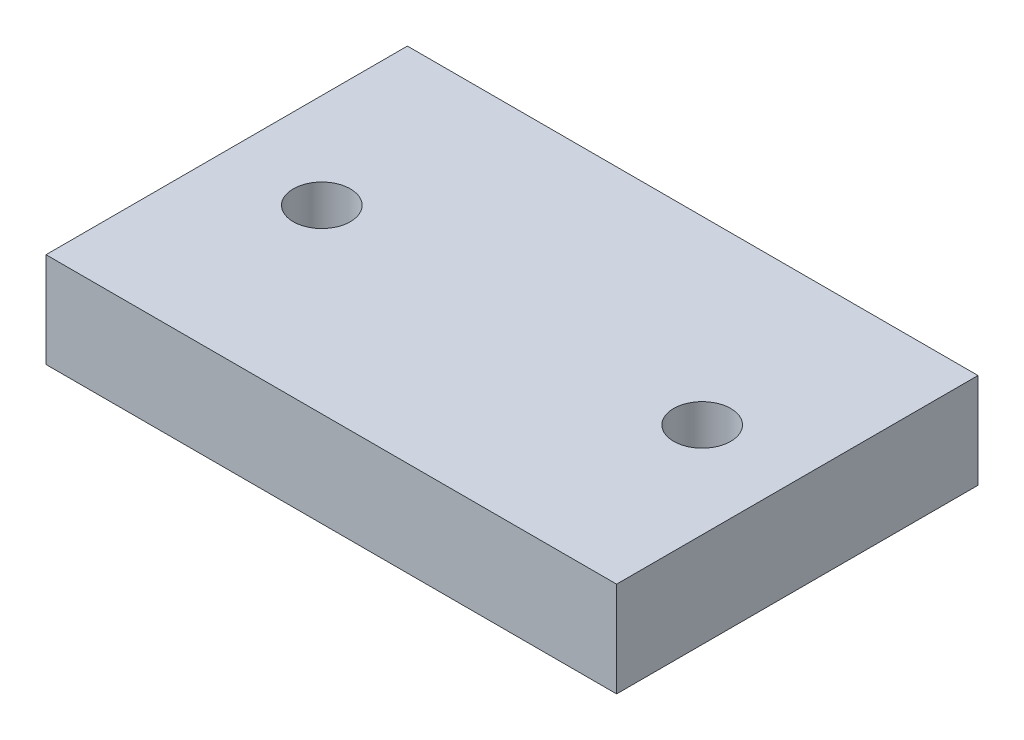
ISO-10303-21;
HEADER;
FILE_DESCRIPTION(('STEP AP214'),'2;1');
FILE_NAME('part.step','',(''),(''),'','','');
FILE_SCHEMA(('AUTOMOTIVE_DESIGN { 1 0 10303 214 1 1 1 1 }'));
ENDSEC;
DATA;
#1=APPLICATION_CONTEXT('core data for automotive mechanical design processes');
#2=APPLICATION_PROTOCOL_DEFINITION('international standard','automotive_design',2000,#1);
#3=PRODUCT_CONTEXT('',#1,'mechanical');
#4=PRODUCT('Part','Part','',(#3));
#5=PRODUCT_RELATED_PRODUCT_CATEGORY('part','',(#4));
#6=PRODUCT_DEFINITION_FORMATION('','',#4);
#7=PRODUCT_DEFINITION_CONTEXT('part definition',#1,'design');
#8=PRODUCT_DEFINITION('design','',#6,#7);
#9=PRODUCT_DEFINITION_SHAPE('','',#8);
#10=(LENGTH_UNIT() NAMED_UNIT(*) SI_UNIT(.MILLI.,.METRE.));
#11=(NAMED_UNIT(*) PLANE_ANGLE_UNIT() SI_UNIT($,.RADIAN.));
#12=(NAMED_UNIT(*) SI_UNIT($,.STERADIAN.) SOLID_ANGLE_UNIT());
#13=UNCERTAINTY_MEASURE_WITH_UNIT(LENGTH_MEASURE(1.E-05),#10,'distance_accuracy_value','');
#14=(GEOMETRIC_REPRESENTATION_CONTEXT(3) GLOBAL_UNCERTAINTY_ASSIGNED_CONTEXT((#13)) GLOBAL_UNIT_ASSIGNED_CONTEXT((#10,
#11,#12)) REPRESENTATION_CONTEXT('',''));
#15=CARTESIAN_POINT('',(0.,0.,0.));
#16=DIRECTION('',(0.,0.,1.));
#17=DIRECTION('',(1.,0.,0.));
#18=AXIS2_PLACEMENT_3D('',#15,#16,#17);
#19=CARTESIAN_POINT('',(0.,2.5,0.));
#20=DIRECTION('',(0.,-1.,0.));
#21=DIRECTION('',(0.,0.,-1.));
#22=AXIS2_PLACEMENT_3D('',#19,#20,#21);
#23=PLANE('',#22);
#24=DIRECTION('',(0.,0.,1.));
#25=VECTOR('',#24,1.);
#26=CARTESIAN_POINT('',(0.,2.5,0.));
#27=LINE('',#26,#25);
#28=CARTESIAN_POINT('',(0.,2.5,-19.));
#29=VERTEX_POINT('',#28);
#30=CARTESIAN_POINT('',(0.,2.5,0.));
#31=VERTEX_POINT('',#30);
#32=EDGE_CURVE('E92',#29,#31,#27,.T.);
#33=ORIENTED_EDGE('',*,*,#32,.T.);
#34=DIRECTION('',(1.,0.,0.));
#35=VECTOR('',#34,1.);
#36=CARTESIAN_POINT('',(0.,2.5,0.));
#37=LINE('',#36,#35);
#38=CARTESIAN_POINT('',(30.,2.5,0.));
#39=VERTEX_POINT('',#38);
#40=EDGE_CURVE('E87',#31,#39,#37,.T.);
#41=ORIENTED_EDGE('',*,*,#40,.T.);
#42=DIRECTION('',(0.,0.,-1.));
#43=VECTOR('',#42,1.);
#44=CARTESIAN_POINT('',(30.,2.5,0.));
#45=LINE('',#44,#43);
#46=CARTESIAN_POINT('',(30.,2.5,-19.));
#47=VERTEX_POINT('',#46);
#48=EDGE_CURVE('E90',#39,#47,#45,.T.);
#49=ORIENTED_EDGE('',*,*,#48,.T.);
#50=DIRECTION('',(-1.,0.,0.));
#51=VECTOR('',#50,1.);
#52=CARTESIAN_POINT('',(0.,2.5,-19.));
#53=LINE('',#52,#51);
#54=EDGE_CURVE('E57',#47,#29,#53,.T.);
#55=ORIENTED_EDGE('',*,*,#54,.T.);
#56=EDGE_LOOP('',(#33,#41,#49,#55));
#57=FACE_BOUND('',#56,.T.);
#58=CARTESIAN_POINT('',(5.,2.5,-9.5));
#59=DIRECTION('',(0.,1.,0.));
#60=DIRECTION('',(0.,0.,1.));
#61=AXIS2_PLACEMENT_3D('',#58,#59,#60);
#62=CIRCLE('',#61,1.5);
#63=CARTESIAN_POINT('',(5.,2.5,-8.));
#64=VERTEX_POINT('',#63);
#65=EDGE_CURVE('E112',#64,#64,#62,.T.);
#66=ORIENTED_EDGE('',*,*,#65,.F.);
#67=EDGE_LOOP('',(#66));
#68=FACE_BOUND('',#67,.T.);
#69=CARTESIAN_POINT('',(25.,2.5,-9.5));
#70=DIRECTION('',(0.,1.,0.));
#71=DIRECTION('',(0.,0.,-1.));
#72=AXIS2_PLACEMENT_3D('',#69,#70,#71);
#73=CIRCLE('',#72,1.5);
#74=CARTESIAN_POINT('',(25.,2.5,-11.));
#75=VERTEX_POINT('',#74);
#76=EDGE_CURVE('E134',#75,#75,#73,.T.);
#77=ORIENTED_EDGE('',*,*,#76,.F.);
#78=EDGE_LOOP('',(#77));
#79=FACE_BOUND('',#78,.T.);
#80=ADVANCED_FACE('F39',(#57,#68,#79),#23,.F.);
#81=CARTESIAN_POINT('',(0.,-2.5,0.));
#82=DIRECTION('',(0.,-1.,0.));
#83=DIRECTION('',(0.,0.,-1.));
#84=AXIS2_PLACEMENT_3D('',#81,#82,#83);
#85=PLANE('',#84);
#86=CARTESIAN_POINT('',(5.,-2.5,-9.5));
#87=DIRECTION('',(0.,1.,0.));
#88=DIRECTION('',(0.,0.,1.));
#89=AXIS2_PLACEMENT_3D('',#86,#87,#88);
#90=CIRCLE('',#89,1.5);
#91=CARTESIAN_POINT('',(5.,-2.5,-8.));
#92=VERTEX_POINT('',#91);
#93=EDGE_CURVE('E130',#92,#92,#90,.T.);
#94=ORIENTED_EDGE('',*,*,#93,.T.);
#95=EDGE_LOOP('',(#94));
#96=FACE_BOUND('',#95,.T.);
#97=DIRECTION('',(0.,0.,1.));
#98=VECTOR('',#97,1.);
#99=CARTESIAN_POINT('',(0.,-2.5,0.));
#100=LINE('',#99,#98);
#101=CARTESIAN_POINT('',(0.,-2.5,-19.));
#102=VERTEX_POINT('',#101);
#103=CARTESIAN_POINT('',(0.,-2.5,0.));
#104=VERTEX_POINT('',#103);
#105=EDGE_CURVE('E108',#102,#104,#100,.T.);
#106=ORIENTED_EDGE('',*,*,#105,.F.);
#107=DIRECTION('',(-1.,0.,0.));
#108=VECTOR('',#107,1.);
#109=CARTESIAN_POINT('',(0.,-2.5,-19.));
#110=LINE('',#109,#108);
#111=CARTESIAN_POINT('',(30.,-2.5,-19.));
#112=VERTEX_POINT('',#111);
#113=EDGE_CURVE('E80',#112,#102,#110,.T.);
#114=ORIENTED_EDGE('',*,*,#113,.F.);
#115=DIRECTION('',(0.,0.,-1.));
#116=VECTOR('',#115,1.);
#117=CARTESIAN_POINT('',(30.,-2.5,0.));
#118=LINE('',#117,#116);
#119=CARTESIAN_POINT('',(30.,-2.5,0.));
#120=VERTEX_POINT('',#119);
#121=EDGE_CURVE('E74',#120,#112,#118,.T.);
#122=ORIENTED_EDGE('',*,*,#121,.F.);
#123=DIRECTION('',(1.,0.,0.));
#124=VECTOR('',#123,1.);
#125=CARTESIAN_POINT('',(0.,-2.5,0.));
#126=LINE('',#125,#124);
#127=EDGE_CURVE('E97',#104,#120,#126,.T.);
#128=ORIENTED_EDGE('',*,*,#127,.F.);
#129=EDGE_LOOP('',(#106,#114,#122,#128));
#130=FACE_BOUND('',#129,.T.);
#131=CARTESIAN_POINT('',(25.,-2.5,-9.5));
#132=DIRECTION('',(0.,1.,0.));
#133=DIRECTION('',(0.,0.,-1.));
#134=AXIS2_PLACEMENT_3D('',#131,#132,#133);
#135=CIRCLE('',#134,1.5);
#136=CARTESIAN_POINT('',(25.,-2.5,-11.));
#137=VERTEX_POINT('',#136);
#138=EDGE_CURVE('E138',#137,#137,#135,.T.);
#139=ORIENTED_EDGE('',*,*,#138,.T.);
#140=EDGE_LOOP('',(#139));
#141=FACE_BOUND('',#140,.T.);
#142=ADVANCED_FACE('F125',(#96,#130,#141),#85,.T.);
#143=CARTESIAN_POINT('',(0.,2.5,0.));
#144=DIRECTION('',(1.,0.,0.));
#145=DIRECTION('',(0.,0.,-1.));
#146=AXIS2_PLACEMENT_3D('',#143,#144,#145);
#147=PLANE('',#146);
#148=ORIENTED_EDGE('',*,*,#105,.T.);
#149=DIRECTION('',(0.,-1.,0.));
#150=VECTOR('',#149,1.);
#151=CARTESIAN_POINT('',(0.,2.5,0.));
#152=LINE('',#151,#150);
#153=EDGE_CURVE('E11',#31,#104,#152,.T.);
#154=ORIENTED_EDGE('',*,*,#153,.F.);
#155=ORIENTED_EDGE('',*,*,#32,.F.);
#156=DIRECTION('',(0.,-1.,0.));
#157=VECTOR('',#156,1.);
#158=CARTESIAN_POINT('',(0.,2.5,-19.));
#159=LINE('',#158,#157);
#160=EDGE_CURVE('E104',#29,#102,#159,.T.);
#161=ORIENTED_EDGE('',*,*,#160,.T.);
#162=EDGE_LOOP('',(#148,#154,#155,#161));
#163=FACE_BOUND('',#162,.T.);
#164=ADVANCED_FACE('F41',(#163),#147,.F.);
#165=CARTESIAN_POINT('',(0.,2.5,0.));
#166=DIRECTION('',(0.,0.,-1.));
#167=DIRECTION('',(-1.,0.,0.));
#168=AXIS2_PLACEMENT_3D('',#165,#166,#167);
#169=PLANE('',#168);
#170=ORIENTED_EDGE('',*,*,#127,.T.);
#171=DIRECTION('',(0.,-1.,0.));
#172=VECTOR('',#171,1.);
#173=CARTESIAN_POINT('',(30.,2.5,0.));
#174=LINE('',#173,#172);
#175=EDGE_CURVE('E49',#39,#120,#174,.T.);
#176=ORIENTED_EDGE('',*,*,#175,.F.);
#177=ORIENTED_EDGE('',*,*,#40,.F.);
#178=ORIENTED_EDGE('',*,*,#153,.T.);
#179=EDGE_LOOP('',(#170,#176,#177,#178));
#180=FACE_BOUND('',#179,.T.);
#181=ADVANCED_FACE('F96',(#180),#169,.F.);
#182=CARTESIAN_POINT('',(30.,2.5,0.));
#183=DIRECTION('',(-1.,0.,0.));
#184=DIRECTION('',(0.,0.,1.));
#185=AXIS2_PLACEMENT_3D('',#182,#183,#184);
#186=PLANE('',#185);
#187=ORIENTED_EDGE('',*,*,#121,.T.);
#188=DIRECTION('',(0.,-1.,0.));
#189=VECTOR('',#188,1.);
#190=CARTESIAN_POINT('',(30.,2.5,-19.));
#191=LINE('',#190,#189);
#192=EDGE_CURVE('E99',#47,#112,#191,.T.);
#193=ORIENTED_EDGE('',*,*,#192,.F.);
#194=ORIENTED_EDGE('',*,*,#48,.F.);
#195=ORIENTED_EDGE('',*,*,#175,.T.);
#196=EDGE_LOOP('',(#187,#193,#194,#195));
#197=FACE_BOUND('',#196,.T.);
#198=ADVANCED_FACE('F100',(#197),#186,.F.);
#199=CARTESIAN_POINT('',(0.,2.5,-19.));
#200=DIRECTION('',(0.,0.,1.));
#201=DIRECTION('',(1.,0.,0.));
#202=AXIS2_PLACEMENT_3D('',#199,#200,#201);
#203=PLANE('',#202);
#204=ORIENTED_EDGE('',*,*,#113,.T.);
#205=ORIENTED_EDGE('',*,*,#160,.F.);
#206=ORIENTED_EDGE('',*,*,#54,.F.);
#207=ORIENTED_EDGE('',*,*,#192,.T.);
#208=EDGE_LOOP('',(#204,#205,#206,#207));
#209=FACE_BOUND('',#208,.T.);
#210=ADVANCED_FACE('F122',(#209),#203,.F.);
#211=CARTESIAN_POINT('',(5.,2.5,-9.5));
#212=DIRECTION('',(0.,-1.,0.));
#213=DIRECTION('',(0.,0.,-1.));
#214=AXIS2_PLACEMENT_3D('',#211,#212,#213);
#215=CYLINDRICAL_SURFACE('',#214,1.5);
#216=ORIENTED_EDGE('',*,*,#65,.T.);
#217=EDGE_LOOP('',(#216));
#218=FACE_BOUND('',#217,.T.);
#219=ORIENTED_EDGE('',*,*,#93,.F.);
#220=EDGE_LOOP('',(#219));
#221=FACE_BOUND('',#220,.T.);
#222=ADVANCED_FACE('F157',(#218,#221),#215,.F.);
#223=CARTESIAN_POINT('',(25.,2.5,-9.5));
#224=DIRECTION('',(0.,-1.,0.));
#225=DIRECTION('',(0.,0.,-1.));
#226=AXIS2_PLACEMENT_3D('',#223,#224,#225);
#227=CYLINDRICAL_SURFACE('',#226,1.5);
#228=ORIENTED_EDGE('',*,*,#76,.T.);
#229=EDGE_LOOP('',(#228));
#230=FACE_BOUND('',#229,.T.);
#231=ORIENTED_EDGE('',*,*,#138,.F.);
#232=EDGE_LOOP('',(#231));
#233=FACE_BOUND('',#232,.T.);
#234=ADVANCED_FACE('F146',(#230,#233),#227,.F.);
#235=CLOSED_SHELL('',(#80,#142,#164,#181,#198,#210,#222,#234));
#236=MANIFOLD_SOLID_BREP('B2',#235);
#237=ADVANCED_BREP_SHAPE_REPRESENTATION('',(#18,#236),#14);
#238=SHAPE_DEFINITION_REPRESENTATION(#9,#237);
ENDSEC;
END-ISO-10303-21;
